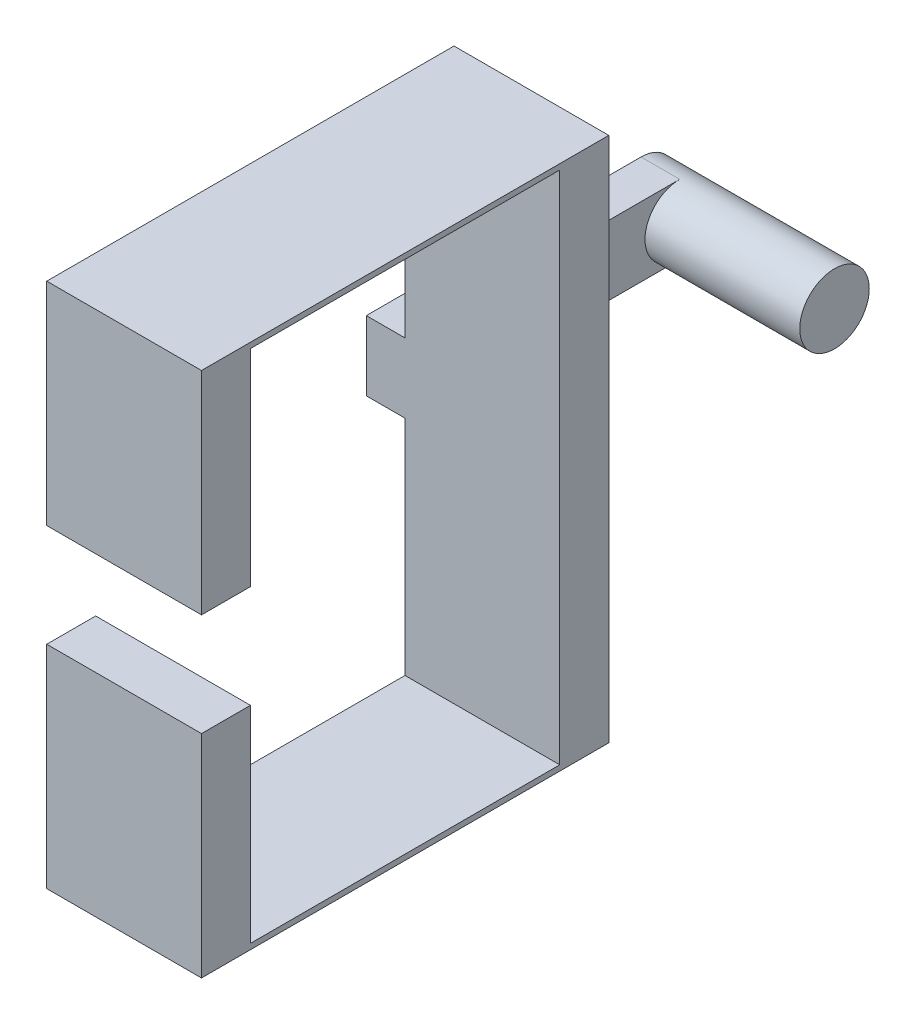
ISO-10303-21;
HEADER;
FILE_DESCRIPTION(('STEP AP214'),'2;1');
FILE_NAME('part.step','',(''),(''),'','','');
FILE_SCHEMA(('AUTOMOTIVE_DESIGN { 1 0 10303 214 1 1 1 1 }'));
ENDSEC;
DATA;
#1=APPLICATION_CONTEXT('core data for automotive mechanical design processes');
#2=APPLICATION_PROTOCOL_DEFINITION('international standard','automotive_design',2000,#1);
#3=PRODUCT_CONTEXT('',#1,'mechanical');
#4=PRODUCT('Part','Part','',(#3));
#5=PRODUCT_RELATED_PRODUCT_CATEGORY('part','',(#4));
#6=PRODUCT_DEFINITION_FORMATION('','',#4);
#7=PRODUCT_DEFINITION_CONTEXT('part definition',#1,'design');
#8=PRODUCT_DEFINITION('design','',#6,#7);
#9=PRODUCT_DEFINITION_SHAPE('','',#8);
#10=(LENGTH_UNIT() NAMED_UNIT(*) SI_UNIT(.MILLI.,.METRE.));
#11=(NAMED_UNIT(*) PLANE_ANGLE_UNIT() SI_UNIT($,.RADIAN.));
#12=(NAMED_UNIT(*) SI_UNIT($,.STERADIAN.) SOLID_ANGLE_UNIT());
#13=UNCERTAINTY_MEASURE_WITH_UNIT(LENGTH_MEASURE(1.E-05),#10,'distance_accuracy_value','');
#14=(GEOMETRIC_REPRESENTATION_CONTEXT(3) GLOBAL_UNCERTAINTY_ASSIGNED_CONTEXT((#13)) GLOBAL_UNIT_ASSIGNED_CONTEXT((#10,
#11,#12)) REPRESENTATION_CONTEXT('',''));
#15=CARTESIAN_POINT('',(0.,0.,0.));
#16=DIRECTION('',(0.,0.,1.));
#17=DIRECTION('',(1.,0.,0.));
#18=AXIS2_PLACEMENT_3D('',#15,#16,#17);
#19=CARTESIAN_POINT('',(-4.76340573312442,36.6586946872582,6.03597507978724));
#20=DIRECTION('',(0.,-1.,0.));
#21=DIRECTION('',(0.,0.,-1.));
#22=AXIS2_PLACEMENT_3D('',#19,#20,#21);
#23=PLANE('',#22);
#24=DIRECTION('',(1.,0.,0.));
#25=VECTOR('',#24,1.);
#26=CARTESIAN_POINT('',(-4.76440573312442,36.6586946872582,-27.7869435629012));
#27=LINE('',#26,#25);
#28=CARTESIAN_POINT('',(-4.76340573312442,36.6586946872582,-27.7869435629012));
#29=VERTEX_POINT('',#28);
#30=CARTESIAN_POINT('',(0.,36.6586946872582,-27.7869435629012));
#31=VERTEX_POINT('',#30);
#32=EDGE_CURVE('E258',#29,#31,#27,.T.);
#33=ORIENTED_EDGE('',*,*,#32,.F.);
#34=DIRECTION('',(0.,0.,-1.));
#35=VECTOR('',#34,1.);
#36=CARTESIAN_POINT('',(-4.76340573312442,36.6586946872582,6.03597507978724));
#37=LINE('',#36,#35);
#38=CARTESIAN_POINT('',(-4.76340573312442,36.6586946872582,6.03597507978724));
#39=VERTEX_POINT('',#38);
#40=EDGE_CURVE('E251',#39,#29,#37,.T.);
#41=ORIENTED_EDGE('',*,*,#40,.F.);
#42=DIRECTION('',(1.,0.,0.));
#43=VECTOR('',#42,1.);
#44=CARTESIAN_POINT('',(-4.76340573312442,36.6586946872582,6.03597507978724));
#45=LINE('',#44,#43);
#46=CARTESIAN_POINT('',(0.,36.6586946872582,6.03597507978724));
#47=VERTEX_POINT('',#46);
#48=EDGE_CURVE('E274',#39,#47,#45,.T.);
#49=ORIENTED_EDGE('',*,*,#48,.T.);
#50=DIRECTION('',(0.,0.,-1.));
#51=VECTOR('',#50,1.);
#52=CARTESIAN_POINT('',(0.,36.6586946872582,6.03597507978724));
#53=LINE('',#52,#51);
#54=CARTESIAN_POINT('',(0.,36.6586946872582,0.));
#55=VERTEX_POINT('',#54);
#56=EDGE_CURVE('E140',#47,#55,#53,.T.);
#57=ORIENTED_EDGE('',*,*,#56,.T.);
#58=EDGE_CURVE('E262',#55,#31,#53,.T.);
#59=ORIENTED_EDGE('',*,*,#58,.T.);
#60=EDGE_LOOP('',(#33,#41,#49,#57,#59));
#61=FACE_BOUND('',#60,.T.);
#62=ADVANCED_FACE('F112',(#61),#23,.F.);
#63=CARTESIAN_POINT('',(0.,0.,0.));
#64=DIRECTION('',(-1.,0.,0.));
#65=DIRECTION('',(0.,0.,1.));
#66=AXIS2_PLACEMENT_3D('',#63,#64,#65);
#67=PLANE('',#66);
#68=CARTESIAN_POINT('',(0.,32.3816133299467,-27.7869435629012));
#69=DIRECTION('',(1.,0.,0.));
#70=DIRECTION('',(0.,0.,-1.));
#71=AXIS2_PLACEMENT_3D('',#68,#69,#70);
#72=CIRCLE('',#71,4.27708135731155);
#73=CARTESIAN_POINT('',(0.,28.1045319726351,-27.7869435629012));
#74=VERTEX_POINT('',#73);
#75=EDGE_CURVE('E246',#31,#74,#72,.T.);
#76=ORIENTED_EDGE('',*,*,#75,.F.);
#77=ORIENTED_EDGE('',*,*,#58,.F.);
#78=DIRECTION('',(0.,1.,0.));
#79=VECTOR('',#78,1.);
#80=CARTESIAN_POINT('',(0.,0.,0.));
#81=LINE('',#80,#79);
#82=CARTESIAN_POINT('',(0.,28.1045319726351,0.));
#83=VERTEX_POINT('',#82);
#84=EDGE_CURVE('E253',#83,#55,#81,.T.);
#85=ORIENTED_EDGE('',*,*,#84,.F.);
#86=DIRECTION('',(0.,0.,1.));
#87=VECTOR('',#86,1.);
#88=CARTESIAN_POINT('',(0.,28.1045319726351,6.03597507978724));
#89=LINE('',#88,#87);
#90=EDGE_CURVE('E125',#74,#83,#89,.T.);
#91=ORIENTED_EDGE('',*,*,#90,.F.);
#92=EDGE_LOOP('',(#76,#77,#85,#91));
#93=FACE_BOUND('',#92,.T.);
#94=ADVANCED_FACE('F248',(#93),#67,.F.);
#95=CARTESIAN_POINT('',(0.,0.,0.));
#96=DIRECTION('',(1.,0.,0.));
#97=DIRECTION('',(0.,0.,-1.));
#98=AXIS2_PLACEMENT_3D('',#95,#96,#97);
#99=PLANE('',#98);
#100=ORIENTED_EDGE('',*,*,#56,.F.);
#101=DIRECTION('',(0.,-1.,0.));
#102=VECTOR('',#101,1.);
#103=CARTESIAN_POINT('',(0.,0.677333329946663,6.03597507978724));
#104=LINE('',#103,#102);
#105=CARTESIAN_POINT('',(0.,64.0858933299467,6.03597507978724));
#106=VERTEX_POINT('',#105);
#107=EDGE_CURVE('E342',#106,#47,#104,.T.);
#108=ORIENTED_EDGE('',*,*,#107,.F.);
#109=DIRECTION('',(0.,0.,-1.));
#110=VECTOR('',#109,1.);
#111=CARTESIAN_POINT('',(0.,64.0858933299467,44.1105750797872));
#112=LINE('',#111,#110);
#113=CARTESIAN_POINT('',(0.,64.0858933299467,44.1105750797872));
#114=VERTEX_POINT('',#113);
#115=EDGE_CURVE('E343',#114,#106,#112,.T.);
#116=ORIENTED_EDGE('',*,*,#115,.F.);
#117=DIRECTION('',(0.,1.,0.));
#118=VECTOR('',#117,1.);
#119=CARTESIAN_POINT('',(0.,38.7062133299467,44.1105750797872));
#120=LINE('',#119,#118);
#121=CARTESIAN_POINT('',(0.,38.7062133299467,44.1105750797872));
#122=VERTEX_POINT('',#121);
#123=EDGE_CURVE('E340',#122,#114,#120,.T.);
#124=ORIENTED_EDGE('',*,*,#123,.F.);
#125=DIRECTION('',(0.,0.,-1.));
#126=VECTOR('',#125,1.);
#127=CARTESIAN_POINT('',(0.,38.7062133299467,50.1335361478922));
#128=LINE('',#127,#126);
#129=CARTESIAN_POINT('',(0.,38.7062133299467,50.1335361478922));
#130=VERTEX_POINT('',#129);
#131=EDGE_CURVE('E333',#130,#122,#128,.T.);
#132=ORIENTED_EDGE('',*,*,#131,.F.);
#133=DIRECTION('',(0.,-1.,0.));
#134=VECTOR('',#133,1.);
#135=CARTESIAN_POINT('',(0.,64.7632266598933,50.1335361478922));
#136=LINE('',#135,#134);
#137=CARTESIAN_POINT('',(0.,64.7632266598933,50.1335361478922));
#138=VERTEX_POINT('',#137);
#139=EDGE_CURVE('E335',#138,#130,#136,.T.);
#140=ORIENTED_EDGE('',*,*,#139,.F.);
#141=DIRECTION('',(0.,0.,1.));
#142=VECTOR('',#141,1.);
#143=CARTESIAN_POINT('',(0.,64.7632266598933,0.));
#144=LINE('',#143,#142);
#145=CARTESIAN_POINT('',(0.,64.7632266598933,0.));
#146=VERTEX_POINT('',#145);
#147=EDGE_CURVE('E328',#146,#138,#144,.T.);
#148=ORIENTED_EDGE('',*,*,#147,.F.);
#149=EDGE_CURVE('E283',#55,#146,#81,.T.);
#150=ORIENTED_EDGE('',*,*,#149,.F.);
#151=EDGE_LOOP('',(#100,#108,#116,#124,#132,#140,#148,#150));
#152=FACE_BOUND('',#151,.T.);
#153=ADVANCED_FACE('F416',(#152),#99,.F.);
#154=CARTESIAN_POINT('',(0.,28.1045319726351,6.03597507978724));
#155=VERTEX_POINT('',#154);
#156=EDGE_CURVE('E12',#83,#155,#89,.T.);
#157=ORIENTED_EDGE('',*,*,#156,.F.);
#158=CARTESIAN_POINT('',(0.,0.,0.));
#159=VERTEX_POINT('',#158);
#160=EDGE_CURVE('E324',#159,#83,#81,.T.);
#161=ORIENTED_EDGE('',*,*,#160,.F.);
#162=DIRECTION('',(0.,0.,-1.));
#163=VECTOR('',#162,1.);
#164=CARTESIAN_POINT('',(0.,0.,0.));
#165=LINE('',#164,#163);
#166=CARTESIAN_POINT('',(0.,0.,50.1335361478922));
#167=VERTEX_POINT('',#166);
#168=EDGE_CURVE('E292',#167,#159,#165,.T.);
#169=ORIENTED_EDGE('',*,*,#168,.F.);
#170=DIRECTION('',(0.,-1.,0.));
#171=VECTOR('',#170,1.);
#172=CARTESIAN_POINT('',(0.,0.,50.1335361478922));
#173=LINE('',#172,#171);
#174=CARTESIAN_POINT('',(0.,26.0570133299467,50.1335361478922));
#175=VERTEX_POINT('',#174);
#176=EDGE_CURVE('E360',#175,#167,#173,.T.);
#177=ORIENTED_EDGE('',*,*,#176,.F.);
#178=DIRECTION('',(0.,0.,1.));
#179=VECTOR('',#178,1.);
#180=CARTESIAN_POINT('',(0.,26.0570133299467,50.1335361478922));
#181=LINE('',#180,#179);
#182=CARTESIAN_POINT('',(0.,26.0570133299467,44.1105750797872));
#183=VERTEX_POINT('',#182);
#184=EDGE_CURVE('E351',#183,#175,#181,.T.);
#185=ORIENTED_EDGE('',*,*,#184,.F.);
#186=DIRECTION('',(0.,1.,0.));
#187=VECTOR('',#186,1.);
#188=CARTESIAN_POINT('',(0.,26.0570133299467,44.1105750797872));
#189=LINE('',#188,#187);
#190=CARTESIAN_POINT('',(0.,0.677333329946658,44.1105750797872));
#191=VERTEX_POINT('',#190);
#192=EDGE_CURVE('E352',#191,#183,#189,.T.);
#193=ORIENTED_EDGE('',*,*,#192,.F.);
#194=DIRECTION('',(0.,0.,1.));
#195=VECTOR('',#194,1.);
#196=CARTESIAN_POINT('',(0.,0.677333329946658,44.1105750797872));
#197=LINE('',#196,#195);
#198=CARTESIAN_POINT('',(0.,0.677333329946663,6.03597507978724));
#199=VERTEX_POINT('',#198);
#200=EDGE_CURVE('E346',#199,#191,#197,.T.);
#201=ORIENTED_EDGE('',*,*,#200,.F.);
#202=EDGE_CURVE('E344',#155,#199,#104,.T.);
#203=ORIENTED_EDGE('',*,*,#202,.F.);
#204=EDGE_LOOP('',(#157,#161,#169,#177,#185,#193,#201,#203));
#205=FACE_BOUND('',#204,.T.);
#206=ADVANCED_FACE('F439',(#205),#99,.F.);
#207=CARTESIAN_POINT('',(19.05,0.,0.));
#208=DIRECTION('',(0.,0.,1.));
#209=DIRECTION('',(1.,0.,0.));
#210=AXIS2_PLACEMENT_3D('',#207,#208,#209);
#211=PLANE('',#210);
#212=ORIENTED_EDGE('',*,*,#160,.T.);
#213=ORIENTED_EDGE('',*,*,#84,.T.);
#214=ORIENTED_EDGE('',*,*,#149,.T.);
#215=DIRECTION('',(-1.,0.,0.));
#216=VECTOR('',#215,1.);
#217=CARTESIAN_POINT('',(19.05,64.7632266598933,0.));
#218=LINE('',#217,#216);
#219=CARTESIAN_POINT('',(19.05,64.7632266598933,0.));
#220=VERTEX_POINT('',#219);
#221=EDGE_CURVE('E113',#220,#146,#218,.T.);
#222=ORIENTED_EDGE('',*,*,#221,.F.);
#223=DIRECTION('',(0.,1.,0.));
#224=VECTOR('',#223,1.);
#225=CARTESIAN_POINT('',(19.05,0.,0.));
#226=LINE('',#225,#224);
#227=CARTESIAN_POINT('',(19.05,0.,0.));
#228=VERTEX_POINT('',#227);
#229=EDGE_CURVE('E288',#228,#220,#226,.T.);
#230=ORIENTED_EDGE('',*,*,#229,.F.);
#231=DIRECTION('',(-1.,0.,0.));
#232=VECTOR('',#231,1.);
#233=CARTESIAN_POINT('',(19.05,0.,0.));
#234=LINE('',#233,#232);
#235=EDGE_CURVE('E322',#228,#159,#234,.T.);
#236=ORIENTED_EDGE('',*,*,#235,.T.);
#237=EDGE_LOOP('',(#212,#213,#214,#222,#230,#236));
#238=FACE_BOUND('',#237,.T.);
#239=ADVANCED_FACE('F114',(#238),#211,.F.);
#240=CARTESIAN_POINT('',(19.05,64.7632266598933,0.));
#241=DIRECTION('',(0.,-1.,0.));
#242=DIRECTION('',(0.,0.,-1.));
#243=AXIS2_PLACEMENT_3D('',#240,#241,#242);
#244=PLANE('',#243);
#245=ORIENTED_EDGE('',*,*,#147,.T.);
#246=DIRECTION('',(-1.,0.,0.));
#247=VECTOR('',#246,1.);
#248=CARTESIAN_POINT('',(19.05,64.7632266598933,50.1335361478922));
#249=LINE('',#248,#247);
#250=CARTESIAN_POINT('',(19.05,64.7632266598933,50.1335361478922));
#251=VERTEX_POINT('',#250);
#252=EDGE_CURVE('E397',#251,#138,#249,.T.);
#253=ORIENTED_EDGE('',*,*,#252,.F.);
#254=DIRECTION('',(0.,0.,1.));
#255=VECTOR('',#254,1.);
#256=CARTESIAN_POINT('',(19.05,64.7632266598933,0.));
#257=LINE('',#256,#255);
#258=EDGE_CURVE('E287',#220,#251,#257,.T.);
#259=ORIENTED_EDGE('',*,*,#258,.F.);
#260=ORIENTED_EDGE('',*,*,#221,.T.);
#261=EDGE_LOOP('',(#245,#253,#259,#260));
#262=FACE_BOUND('',#261,.T.);
#263=ADVANCED_FACE('F411',(#262),#244,.F.);
#264=CARTESIAN_POINT('',(19.05,64.7632266598933,50.1335361478922));
#265=DIRECTION('',(0.,0.,-1.));
#266=DIRECTION('',(-1.,0.,0.));
#267=AXIS2_PLACEMENT_3D('',#264,#265,#266);
#268=PLANE('',#267);
#269=ORIENTED_EDGE('',*,*,#139,.T.);
#270=DIRECTION('',(-1.,0.,0.));
#271=VECTOR('',#270,1.);
#272=CARTESIAN_POINT('',(19.05,38.7062133299467,50.1335361478922));
#273=LINE('',#272,#271);
#274=CARTESIAN_POINT('',(19.05,38.7062133299467,50.1335361478922));
#275=VERTEX_POINT('',#274);
#276=EDGE_CURVE('E400',#275,#130,#273,.T.);
#277=ORIENTED_EDGE('',*,*,#276,.F.);
#278=DIRECTION('',(0.,-1.,0.));
#279=VECTOR('',#278,1.);
#280=CARTESIAN_POINT('',(19.05,64.7632266598933,50.1335361478922));
#281=LINE('',#280,#279);
#282=EDGE_CURVE('E294',#251,#275,#281,.T.);
#283=ORIENTED_EDGE('',*,*,#282,.F.);
#284=ORIENTED_EDGE('',*,*,#252,.T.);
#285=EDGE_LOOP('',(#269,#277,#283,#284));
#286=FACE_BOUND('',#285,.T.);
#287=ADVANCED_FACE('F425',(#286),#268,.F.);
#288=CARTESIAN_POINT('',(19.05,38.7062133299467,50.1335361478922));
#289=DIRECTION('',(0.,1.,0.));
#290=DIRECTION('',(0.,0.,1.));
#291=AXIS2_PLACEMENT_3D('',#288,#289,#290);
#292=PLANE('',#291);
#293=ORIENTED_EDGE('',*,*,#131,.T.);
#294=DIRECTION('',(-1.,0.,0.));
#295=VECTOR('',#294,1.);
#296=CARTESIAN_POINT('',(19.05,38.7062133299467,44.1105750797872));
#297=LINE('',#296,#295);
#298=CARTESIAN_POINT('',(19.05,38.7062133299467,44.1105750797872));
#299=VERTEX_POINT('',#298);
#300=EDGE_CURVE('E395',#299,#122,#297,.T.);
#301=ORIENTED_EDGE('',*,*,#300,.F.);
#302=DIRECTION('',(0.,0.,-1.));
#303=VECTOR('',#302,1.);
#304=CARTESIAN_POINT('',(19.05,38.7062133299467,50.1335361478922));
#305=LINE('',#304,#303);
#306=EDGE_CURVE('E299',#275,#299,#305,.T.);
#307=ORIENTED_EDGE('',*,*,#306,.F.);
#308=ORIENTED_EDGE('',*,*,#276,.T.);
#309=EDGE_LOOP('',(#293,#301,#307,#308));
#310=FACE_BOUND('',#309,.T.);
#311=ADVANCED_FACE('F422',(#310),#292,.F.);
#312=CARTESIAN_POINT('',(19.05,38.7062133299467,44.1105750797872));
#313=DIRECTION('',(0.,0.,1.));
#314=DIRECTION('',(1.,0.,0.));
#315=AXIS2_PLACEMENT_3D('',#312,#313,#314);
#316=PLANE('',#315);
#317=ORIENTED_EDGE('',*,*,#123,.T.);
#318=DIRECTION('',(-1.,0.,0.));
#319=VECTOR('',#318,1.);
#320=CARTESIAN_POINT('',(19.05,64.0858933299467,44.1105750797872));
#321=LINE('',#320,#319);
#322=CARTESIAN_POINT('',(19.05,64.0858933299467,44.1105750797872));
#323=VERTEX_POINT('',#322);
#324=EDGE_CURVE('E386',#323,#114,#321,.T.);
#325=ORIENTED_EDGE('',*,*,#324,.F.);
#326=DIRECTION('',(0.,1.,0.));
#327=VECTOR('',#326,1.);
#328=CARTESIAN_POINT('',(19.05,38.7062133299467,44.1105750797872));
#329=LINE('',#328,#327);
#330=EDGE_CURVE('E298',#299,#323,#329,.T.);
#331=ORIENTED_EDGE('',*,*,#330,.F.);
#332=ORIENTED_EDGE('',*,*,#300,.T.);
#333=EDGE_LOOP('',(#317,#325,#331,#332));
#334=FACE_BOUND('',#333,.T.);
#335=ADVANCED_FACE('F536',(#334),#316,.F.);
#336=CARTESIAN_POINT('',(19.05,64.0858933299467,44.1105750797872));
#337=DIRECTION('',(0.,1.,0.));
#338=DIRECTION('',(0.,0.,1.));
#339=AXIS2_PLACEMENT_3D('',#336,#337,#338);
#340=PLANE('',#339);
#341=ORIENTED_EDGE('',*,*,#115,.T.);
#342=DIRECTION('',(-1.,0.,0.));
#343=VECTOR('',#342,1.);
#344=CARTESIAN_POINT('',(19.05,64.0858933299467,6.03597507978724));
#345=LINE('',#344,#343);
#346=CARTESIAN_POINT('',(19.05,64.0858933299467,6.03597507978724));
#347=VERTEX_POINT('',#346);
#348=EDGE_CURVE('E384',#347,#106,#345,.T.);
#349=ORIENTED_EDGE('',*,*,#348,.F.);
#350=DIRECTION('',(0.,0.,-1.));
#351=VECTOR('',#350,1.);
#352=CARTESIAN_POINT('',(19.05,64.0858933299467,44.1105750797872));
#353=LINE('',#352,#351);
#354=EDGE_CURVE('E301',#323,#347,#353,.T.);
#355=ORIENTED_EDGE('',*,*,#354,.F.);
#356=ORIENTED_EDGE('',*,*,#324,.T.);
#357=EDGE_LOOP('',(#341,#349,#355,#356));
#358=FACE_BOUND('',#357,.T.);
#359=ADVANCED_FACE('F531',(#358),#340,.F.);
#360=CARTESIAN_POINT('',(19.05,0.677333329946663,6.03597507978724));
#361=DIRECTION('',(0.,0.,-1.));
#362=DIRECTION('',(-1.,0.,0.));
#363=AXIS2_PLACEMENT_3D('',#360,#361,#362);
#364=PLANE('',#363);
#365=ORIENTED_EDGE('',*,*,#107,.T.);
#366=ORIENTED_EDGE('',*,*,#48,.F.);
#367=DIRECTION('',(0.,1.,0.));
#368=VECTOR('',#367,1.);
#369=CARTESIAN_POINT('',(-4.76340573312442,36.6586946872582,6.03597507978724));
#370=LINE('',#369,#368);
#371=CARTESIAN_POINT('',(-4.76340573312442,28.1045319726351,6.03597507978724));
#372=VERTEX_POINT('',#371);
#373=EDGE_CURVE('E275',#372,#39,#370,.T.);
#374=ORIENTED_EDGE('',*,*,#373,.F.);
#375=DIRECTION('',(1.,0.,0.));
#376=VECTOR('',#375,1.);
#377=CARTESIAN_POINT('',(-4.76340573312442,28.1045319726351,6.03597507978724));
#378=LINE('',#377,#376);
#379=EDGE_CURVE('E282',#372,#155,#378,.T.);
#380=ORIENTED_EDGE('',*,*,#379,.T.);
#381=ORIENTED_EDGE('',*,*,#202,.T.);
#382=DIRECTION('',(-1.,0.,0.));
#383=VECTOR('',#382,1.);
#384=CARTESIAN_POINT('',(19.05,0.677333329946663,6.03597507978724));
#385=LINE('',#384,#383);
#386=CARTESIAN_POINT('',(19.05,0.677333329946663,6.03597507978724));
#387=VERTEX_POINT('',#386);
#388=EDGE_CURVE('E381',#387,#199,#385,.T.);
#389=ORIENTED_EDGE('',*,*,#388,.F.);
#390=DIRECTION('',(0.,-1.,0.));
#391=VECTOR('',#390,1.);
#392=CARTESIAN_POINT('',(19.05,0.677333329946663,6.03597507978724));
#393=LINE('',#392,#391);
#394=EDGE_CURVE('E308',#347,#387,#393,.T.);
#395=ORIENTED_EDGE('',*,*,#394,.F.);
#396=ORIENTED_EDGE('',*,*,#348,.T.);
#397=EDGE_LOOP('',(#365,#366,#374,#380,#381,#389,#395,#396));
#398=FACE_BOUND('',#397,.T.);
#399=ADVANCED_FACE('F443',(#398),#364,.F.);
#400=CARTESIAN_POINT('',(19.05,0.677333329946658,44.1105750797872));
#401=DIRECTION('',(0.,-1.,0.));
#402=DIRECTION('',(0.,0.,-1.));
#403=AXIS2_PLACEMENT_3D('',#400,#401,#402);
#404=PLANE('',#403);
#405=ORIENTED_EDGE('',*,*,#200,.T.);
#406=DIRECTION('',(-1.,0.,0.));
#407=VECTOR('',#406,1.);
#408=CARTESIAN_POINT('',(19.05,0.677333329946658,44.1105750797872));
#409=LINE('',#408,#407);
#410=CARTESIAN_POINT('',(19.05,0.677333329946658,44.1105750797872));
#411=VERTEX_POINT('',#410);
#412=EDGE_CURVE('E380',#411,#191,#409,.T.);
#413=ORIENTED_EDGE('',*,*,#412,.F.);
#414=DIRECTION('',(0.,0.,1.));
#415=VECTOR('',#414,1.);
#416=CARTESIAN_POINT('',(19.05,0.677333329946658,44.1105750797872));
#417=LINE('',#416,#415);
#418=EDGE_CURVE('E310',#387,#411,#417,.T.);
#419=ORIENTED_EDGE('',*,*,#418,.F.);
#420=ORIENTED_EDGE('',*,*,#388,.T.);
#421=EDGE_LOOP('',(#405,#413,#419,#420));
#422=FACE_BOUND('',#421,.T.);
#423=ADVANCED_FACE('F528',(#422),#404,.F.);
#424=CARTESIAN_POINT('',(19.05,26.0570133299467,44.1105750797872));
#425=DIRECTION('',(0.,0.,1.));
#426=DIRECTION('',(1.,0.,0.));
#427=AXIS2_PLACEMENT_3D('',#424,#425,#426);
#428=PLANE('',#427);
#429=ORIENTED_EDGE('',*,*,#192,.T.);
#430=DIRECTION('',(-1.,0.,0.));
#431=VECTOR('',#430,1.);
#432=CARTESIAN_POINT('',(19.05,26.0570133299467,44.1105750797872));
#433=LINE('',#432,#431);
#434=CARTESIAN_POINT('',(19.05,26.0570133299467,44.1105750797872));
#435=VERTEX_POINT('',#434);
#436=EDGE_CURVE('E373',#435,#183,#433,.T.);
#437=ORIENTED_EDGE('',*,*,#436,.F.);
#438=DIRECTION('',(0.,1.,0.));
#439=VECTOR('',#438,1.);
#440=CARTESIAN_POINT('',(19.05,26.0570133299467,44.1105750797872));
#441=LINE('',#440,#439);
#442=EDGE_CURVE('E315',#411,#435,#441,.T.);
#443=ORIENTED_EDGE('',*,*,#442,.F.);
#444=ORIENTED_EDGE('',*,*,#412,.T.);
#445=EDGE_LOOP('',(#429,#437,#443,#444));
#446=FACE_BOUND('',#445,.T.);
#447=ADVANCED_FACE('F525',(#446),#428,.F.);
#448=CARTESIAN_POINT('',(19.05,26.0570133299467,50.1335361478922));
#449=DIRECTION('',(0.,-1.,0.));
#450=DIRECTION('',(0.,0.,-1.));
#451=AXIS2_PLACEMENT_3D('',#448,#449,#450);
#452=PLANE('',#451);
#453=ORIENTED_EDGE('',*,*,#184,.T.);
#454=DIRECTION('',(-1.,0.,0.));
#455=VECTOR('',#454,1.);
#456=CARTESIAN_POINT('',(19.05,26.0570133299467,50.1335361478922));
#457=LINE('',#456,#455);
#458=CARTESIAN_POINT('',(19.05,26.0570133299467,50.1335361478922));
#459=VERTEX_POINT('',#458);
#460=EDGE_CURVE('E369',#459,#175,#457,.T.);
#461=ORIENTED_EDGE('',*,*,#460,.F.);
#462=DIRECTION('',(0.,0.,1.));
#463=VECTOR('',#462,1.);
#464=CARTESIAN_POINT('',(19.05,26.0570133299467,50.1335361478922));
#465=LINE('',#464,#463);
#466=EDGE_CURVE('E312',#435,#459,#465,.T.);
#467=ORIENTED_EDGE('',*,*,#466,.F.);
#468=ORIENTED_EDGE('',*,*,#436,.T.);
#469=EDGE_LOOP('',(#453,#461,#467,#468));
#470=FACE_BOUND('',#469,.T.);
#471=ADVANCED_FACE('F520',(#470),#452,.F.);
#472=CARTESIAN_POINT('',(19.05,0.,50.1335361478922));
#473=DIRECTION('',(0.,0.,-1.));
#474=DIRECTION('',(-1.,0.,0.));
#475=AXIS2_PLACEMENT_3D('',#472,#473,#474);
#476=PLANE('',#475);
#477=ORIENTED_EDGE('',*,*,#176,.T.);
#478=DIRECTION('',(-1.,0.,0.));
#479=VECTOR('',#478,1.);
#480=CARTESIAN_POINT('',(19.05,0.,50.1335361478922));
#481=LINE('',#480,#479);
#482=CARTESIAN_POINT('',(19.05,0.,50.1335361478922));
#483=VERTEX_POINT('',#482);
#484=EDGE_CURVE('E364',#483,#167,#481,.T.);
#485=ORIENTED_EDGE('',*,*,#484,.F.);
#486=DIRECTION('',(0.,-1.,0.));
#487=VECTOR('',#486,1.);
#488=CARTESIAN_POINT('',(19.05,0.,50.1335361478922));
#489=LINE('',#488,#487);
#490=EDGE_CURVE('E318',#459,#483,#489,.T.);
#491=ORIENTED_EDGE('',*,*,#490,.F.);
#492=ORIENTED_EDGE('',*,*,#460,.T.);
#493=EDGE_LOOP('',(#477,#485,#491,#492));
#494=FACE_BOUND('',#493,.T.);
#495=ADVANCED_FACE('F513',(#494),#476,.F.);
#496=CARTESIAN_POINT('',(19.05,0.,0.));
#497=DIRECTION('',(0.,1.,0.));
#498=DIRECTION('',(0.,0.,1.));
#499=AXIS2_PLACEMENT_3D('',#496,#497,#498);
#500=PLANE('',#499);
#501=ORIENTED_EDGE('',*,*,#168,.T.);
#502=ORIENTED_EDGE('',*,*,#235,.F.);
#503=DIRECTION('',(0.,0.,-1.));
#504=VECTOR('',#503,1.);
#505=CARTESIAN_POINT('',(19.05,0.,0.));
#506=LINE('',#505,#504);
#507=EDGE_CURVE('E321',#483,#228,#506,.T.);
#508=ORIENTED_EDGE('',*,*,#507,.F.);
#509=ORIENTED_EDGE('',*,*,#484,.T.);
#510=EDGE_LOOP('',(#501,#502,#508,#509));
#511=FACE_BOUND('',#510,.T.);
#512=ADVANCED_FACE('F436',(#511),#500,.F.);
#513=CARTESIAN_POINT('',(19.05,0.,0.));
#514=DIRECTION('',(1.,0.,0.));
#515=DIRECTION('',(0.,0.,-1.));
#516=AXIS2_PLACEMENT_3D('',#513,#514,#515);
#517=PLANE('',#516);
#518=ORIENTED_EDGE('',*,*,#229,.T.);
#519=ORIENTED_EDGE('',*,*,#258,.T.);
#520=ORIENTED_EDGE('',*,*,#282,.T.);
#521=ORIENTED_EDGE('',*,*,#306,.T.);
#522=ORIENTED_EDGE('',*,*,#330,.T.);
#523=ORIENTED_EDGE('',*,*,#354,.T.);
#524=ORIENTED_EDGE('',*,*,#394,.T.);
#525=ORIENTED_EDGE('',*,*,#418,.T.);
#526=ORIENTED_EDGE('',*,*,#442,.T.);
#527=ORIENTED_EDGE('',*,*,#466,.T.);
#528=ORIENTED_EDGE('',*,*,#490,.T.);
#529=ORIENTED_EDGE('',*,*,#507,.T.);
#530=EDGE_LOOP('',(#518,#519,#520,#521,#522,#523,#524,#525,#526,#527,#528,#529));
#531=FACE_BOUND('',#530,.T.);
#532=ADVANCED_FACE('F427',(#531),#517,.T.);
#533=CARTESIAN_POINT('',(-4.76340573312442,28.1045319726351,6.03597507978724));
#534=DIRECTION('',(0.,1.,0.));
#535=DIRECTION('',(0.,0.,1.));
#536=AXIS2_PLACEMENT_3D('',#533,#534,#535);
#537=PLANE('',#536);
#538=DIRECTION('',(0.,0.,1.));
#539=VECTOR('',#538,1.);
#540=CARTESIAN_POINT('',(-4.76340573312442,28.1045319726351,6.03597507978724));
#541=LINE('',#540,#539);
#542=CARTESIAN_POINT('',(-4.76340573312442,28.1045319726351,-27.7869435629012));
#543=VERTEX_POINT('',#542);
#544=EDGE_CURVE('E236',#543,#372,#541,.T.);
#545=ORIENTED_EDGE('',*,*,#544,.F.);
#546=DIRECTION('',(1.,0.,0.));
#547=VECTOR('',#546,1.);
#548=CARTESIAN_POINT('',(-4.76440573312442,28.1045319726351,-27.7869435629012));
#549=LINE('',#548,#547);
#550=EDGE_CURVE('E231',#543,#74,#549,.T.);
#551=ORIENTED_EDGE('',*,*,#550,.T.);
#552=ORIENTED_EDGE('',*,*,#90,.T.);
#553=ORIENTED_EDGE('',*,*,#156,.T.);
#554=ORIENTED_EDGE('',*,*,#379,.F.);
#555=EDGE_LOOP('',(#545,#551,#552,#553,#554));
#556=FACE_BOUND('',#555,.T.);
#557=ADVANCED_FACE('F232',(#556),#537,.F.);
#558=CARTESIAN_POINT('',(-4.76340573312442,0.,0.));
#559=DIRECTION('',(-1.,0.,0.));
#560=DIRECTION('',(0.,0.,1.));
#561=AXIS2_PLACEMENT_3D('',#558,#559,#560);
#562=PLANE('',#561);
#563=CARTESIAN_POINT('',(-4.76340573312442,32.3816133299467,-27.7869435629012));
#564=DIRECTION('',(-1.,0.,0.));
#565=DIRECTION('',(0.,0.,1.));
#566=AXIS2_PLACEMENT_3D('',#563,#564,#565);
#567=CIRCLE('',#566,4.27708135731154);
#568=EDGE_CURVE('E129',#29,#543,#567,.T.);
#569=ORIENTED_EDGE('',*,*,#568,.T.);
#570=ORIENTED_EDGE('',*,*,#544,.T.);
#571=ORIENTED_EDGE('',*,*,#373,.T.);
#572=ORIENTED_EDGE('',*,*,#40,.T.);
#573=EDGE_LOOP('',(#569,#570,#571,#572));
#574=FACE_BOUND('',#573,.T.);
#575=ADVANCED_FACE('F446',(#574),#562,.T.);
#576=CARTESIAN_POINT('',(19.05,32.3816133299467,-27.7869435629012));
#577=DIRECTION('',(-1.,0.,0.));
#578=DIRECTION('',(0.,0.,1.));
#579=AXIS2_PLACEMENT_3D('',#576,#577,#578);
#580=CYLINDRICAL_SURFACE('',#579,4.27708135731155);
#581=CARTESIAN_POINT('',(19.05,32.3816133299467,-27.7869435629012));
#582=DIRECTION('',(1.,0.,0.));
#583=DIRECTION('',(0.,0.,-1.));
#584=AXIS2_PLACEMENT_3D('',#581,#582,#583);
#585=CIRCLE('',#584,4.27708135731155);
#586=CARTESIAN_POINT('',(19.05,32.3816133299467,-32.0640249202128));
#587=VERTEX_POINT('',#586);
#588=EDGE_CURVE('E256',#587,#587,#585,.T.);
#589=ORIENTED_EDGE('',*,*,#588,.F.);
#590=EDGE_LOOP('',(#589));
#591=FACE_BOUND('',#590,.T.);
#592=ORIENTED_EDGE('',*,*,#75,.T.);
#593=ORIENTED_EDGE('',*,*,#550,.F.);
#594=ORIENTED_EDGE('',*,*,#568,.F.);
#595=ORIENTED_EDGE('',*,*,#32,.T.);
#596=EDGE_LOOP('',(#592,#593,#594,#595));
#597=FACE_BOUND('',#596,.T.);
#598=ADVANCED_FACE('F255',(#591,#597),#580,.T.);
#599=CARTESIAN_POINT('',(19.05,32.3816133299467,-27.7869435629012));
#600=DIRECTION('',(1.,0.,0.));
#601=DIRECTION('',(0.,0.,-1.));
#602=AXIS2_PLACEMENT_3D('',#599,#600,#601);
#603=PLANE('',#602);
#604=ORIENTED_EDGE('',*,*,#588,.T.);
#605=EDGE_LOOP('',(#604));
#606=FACE_BOUND('',#605,.T.);
#607=ADVANCED_FACE('F663',(#606),#603,.T.);
#608=CLOSED_SHELL('',(#62,#94,#153,#206,#239,#263,#287,#311,#335,#359,#399,#423,#447,#471,#495,
#512,#532,#557,#575,#598,#607));
#609=MANIFOLD_SOLID_BREP('B2',#608);
#610=ADVANCED_BREP_SHAPE_REPRESENTATION('',(#18,#609),#14);
#611=SHAPE_DEFINITION_REPRESENTATION(#9,#610);
ENDSEC;
END-ISO-10303-21;
